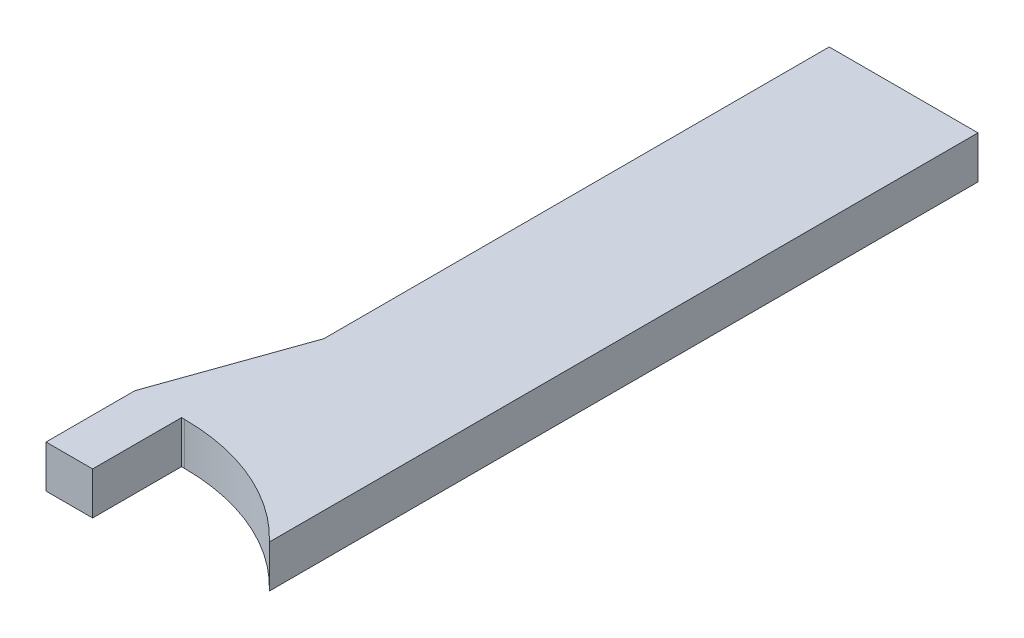
ISO-10303-21;
HEADER;
FILE_DESCRIPTION(('STEP AP214'),'2;1');
FILE_NAME('part.step','',(''),(''),'','','');
FILE_SCHEMA(('AUTOMOTIVE_DESIGN { 1 0 10303 214 1 1 1 1 }'));
ENDSEC;
DATA;
#1=APPLICATION_CONTEXT('core data for automotive mechanical design processes');
#2=APPLICATION_PROTOCOL_DEFINITION('international standard','automotive_design',2000,#1);
#3=PRODUCT_CONTEXT('',#1,'mechanical');
#4=PRODUCT('Part','Part','',(#3));
#5=PRODUCT_RELATED_PRODUCT_CATEGORY('part','',(#4));
#6=PRODUCT_DEFINITION_FORMATION('','',#4);
#7=PRODUCT_DEFINITION_CONTEXT('part definition',#1,'design');
#8=PRODUCT_DEFINITION('design','',#6,#7);
#9=PRODUCT_DEFINITION_SHAPE('','',#8);
#10=(LENGTH_UNIT() NAMED_UNIT(*) SI_UNIT(.MILLI.,.METRE.));
#11=(NAMED_UNIT(*) PLANE_ANGLE_UNIT() SI_UNIT($,.RADIAN.));
#12=(NAMED_UNIT(*) SI_UNIT($,.STERADIAN.) SOLID_ANGLE_UNIT());
#13=UNCERTAINTY_MEASURE_WITH_UNIT(LENGTH_MEASURE(1.E-05),#10,'distance_accuracy_value','');
#14=(GEOMETRIC_REPRESENTATION_CONTEXT(3) GLOBAL_UNCERTAINTY_ASSIGNED_CONTEXT((#13)) GLOBAL_UNIT_ASSIGNED_CONTEXT((#10,
#11,#12)) REPRESENTATION_CONTEXT('',''));
#15=CARTESIAN_POINT('',(0.,0.,0.));
#16=DIRECTION('',(0.,0.,1.));
#17=DIRECTION('',(1.,0.,0.));
#18=AXIS2_PLACEMENT_3D('',#15,#16,#17);
#19=CARTESIAN_POINT('',(0.,3.,0.));
#20=DIRECTION('',(0.,-1.,0.));
#21=DIRECTION('',(0.,0.,-1.));
#22=AXIS2_PLACEMENT_3D('',#19,#20,#21);
#23=CYLINDRICAL_SURFACE('',#22,14.5);
#24=CARTESIAN_POINT('',(0.,0.,0.));
#25=DIRECTION('',(0.,1.,0.));
#26=DIRECTION('',(0.,0.,1.));
#27=AXIS2_PLACEMENT_3D('',#24,#25,#26);
#28=CIRCLE('',#27,14.5);
#29=CARTESIAN_POINT('',(10.5,0.,-10.));
#30=VERTEX_POINT('',#29);
#31=CARTESIAN_POINT('',(0.,0.,-14.5));
#32=VERTEX_POINT('',#31);
#33=EDGE_CURVE('E171',#30,#32,#28,.T.);
#34=ORIENTED_EDGE('',*,*,#33,.F.);
#35=DIRECTION('',(0.,-1.,0.));
#36=VECTOR('',#35,1.);
#37=CARTESIAN_POINT('',(10.5,3.,-10.));
#38=LINE('',#37,#36);
#39=CARTESIAN_POINT('',(10.5,3.,-10.));
#40=VERTEX_POINT('',#39);
#41=EDGE_CURVE('E11',#40,#30,#38,.T.);
#42=ORIENTED_EDGE('',*,*,#41,.F.);
#43=CARTESIAN_POINT('',(0.,3.,0.));
#44=DIRECTION('',(0.,1.,0.));
#45=DIRECTION('',(0.,0.,1.));
#46=AXIS2_PLACEMENT_3D('',#43,#44,#45);
#47=CIRCLE('',#46,14.5);
#48=CARTESIAN_POINT('',(0.,3.,-14.5));
#49=VERTEX_POINT('',#48);
#50=EDGE_CURVE('E120',#40,#49,#47,.T.);
#51=ORIENTED_EDGE('',*,*,#50,.T.);
#52=DIRECTION('',(0.,-1.,0.));
#53=VECTOR('',#52,1.);
#54=CARTESIAN_POINT('',(0.,3.,-14.5));
#55=LINE('',#54,#53);
#56=EDGE_CURVE('E50',#49,#32,#55,.T.);
#57=ORIENTED_EDGE('',*,*,#56,.T.);
#58=EDGE_LOOP('',(#34,#42,#51,#57));
#59=FACE_BOUND('',#58,.T.);
#60=ADVANCED_FACE('F43',(#59),#23,.F.);
#61=CARTESIAN_POINT('',(10.5,3.,0.));
#62=DIRECTION('',(-1.,0.,0.));
#63=DIRECTION('',(0.,0.,1.));
#64=AXIS2_PLACEMENT_3D('',#61,#62,#63);
#65=PLANE('',#64);
#66=DIRECTION('',(0.,0.,-1.));
#67=VECTOR('',#66,1.);
#68=CARTESIAN_POINT('',(10.5,0.,0.));
#69=LINE('',#68,#67);
#70=CARTESIAN_POINT('',(10.5,0.,-60.));
#71=VERTEX_POINT('',#70);
#72=EDGE_CURVE('E128',#30,#71,#69,.T.);
#73=ORIENTED_EDGE('',*,*,#72,.T.);
#74=DIRECTION('',(0.,1.,0.));
#75=VECTOR('',#74,1.);
#76=CARTESIAN_POINT('',(10.5,-30.1271163298149,-60.));
#77=LINE('',#76,#75);
#78=CARTESIAN_POINT('',(10.5,3.,-60.));
#79=VERTEX_POINT('',#78);
#80=EDGE_CURVE('E125',#71,#79,#77,.T.);
#81=ORIENTED_EDGE('',*,*,#80,.T.);
#82=DIRECTION('',(0.,0.,-1.));
#83=VECTOR('',#82,1.);
#84=CARTESIAN_POINT('',(10.5,3.,0.));
#85=LINE('',#84,#83);
#86=EDGE_CURVE('E113',#40,#79,#85,.T.);
#87=ORIENTED_EDGE('',*,*,#86,.F.);
#88=ORIENTED_EDGE('',*,*,#41,.T.);
#89=EDGE_LOOP('',(#73,#81,#87,#88));
#90=FACE_BOUND('',#89,.T.);
#91=ADVANCED_FACE('F126',(#90),#65,.F.);
#92=CARTESIAN_POINT('',(0.,3.,0.));
#93=DIRECTION('',(1.,0.,0.));
#94=DIRECTION('',(0.,0.,-1.));
#95=AXIS2_PLACEMENT_3D('',#92,#93,#94);
#96=PLANE('',#95);
#97=DIRECTION('',(0.,0.,1.));
#98=VECTOR('',#97,1.);
#99=CARTESIAN_POINT('',(0.,0.,0.));
#100=LINE('',#99,#98);
#101=CARTESIAN_POINT('',(0.,0.,-60.));
#102=VERTEX_POINT('',#101);
#103=CARTESIAN_POINT('',(0.,0.,-24.3471749283453));
#104=VERTEX_POINT('',#103);
#105=EDGE_CURVE('E179',#102,#104,#100,.T.);
#106=ORIENTED_EDGE('',*,*,#105,.T.);
#107=DIRECTION('',(0.,1.,0.));
#108=VECTOR('',#107,1.);
#109=CARTESIAN_POINT('',(0.,0.,-24.3471749283453));
#110=LINE('',#109,#108);
#111=CARTESIAN_POINT('',(0.,3.,-24.3471749283453));
#112=VERTEX_POINT('',#111);
#113=EDGE_CURVE('E169',#104,#112,#110,.T.);
#114=ORIENTED_EDGE('',*,*,#113,.T.);
#115=DIRECTION('',(0.,0.,1.));
#116=VECTOR('',#115,1.);
#117=CARTESIAN_POINT('',(0.,3.,0.));
#118=LINE('',#117,#116);
#119=CARTESIAN_POINT('',(0.,3.,-60.));
#120=VERTEX_POINT('',#119);
#121=EDGE_CURVE('E122',#120,#112,#118,.T.);
#122=ORIENTED_EDGE('',*,*,#121,.F.);
#123=DIRECTION('',(0.,1.,0.));
#124=VECTOR('',#123,1.);
#125=CARTESIAN_POINT('',(0.,-30.1271163298149,-60.));
#126=LINE('',#125,#124);
#127=EDGE_CURVE('E132',#102,#120,#126,.T.);
#128=ORIENTED_EDGE('',*,*,#127,.F.);
#129=EDGE_LOOP('',(#106,#114,#122,#128));
#130=FACE_BOUND('',#129,.T.);
#131=ADVANCED_FACE('F193',(#130),#96,.F.);
#132=CARTESIAN_POINT('',(0.,3.,0.));
#133=DIRECTION('',(0.,1.,0.));
#134=DIRECTION('',(0.,0.,1.));
#135=AXIS2_PLACEMENT_3D('',#132,#133,#134);
#136=PLANE('',#135);
#137=ORIENTED_EDGE('',*,*,#50,.F.);
#138=ORIENTED_EDGE('',*,*,#86,.T.);
#139=DIRECTION('',(-1.,0.,0.));
#140=VECTOR('',#139,1.);
#141=CARTESIAN_POINT('',(0.,3.,-60.));
#142=LINE('',#141,#140);
#143=EDGE_CURVE('E118',#79,#120,#142,.T.);
#144=ORIENTED_EDGE('',*,*,#143,.T.);
#145=ORIENTED_EDGE('',*,*,#121,.T.);
#146=DIRECTION('',(0.3339697800326,0.,-0.942583781965814));
#147=VECTOR('',#146,1.);
#148=CARTESIAN_POINT('',(-7.66435671720969,3.,-2.71558197362528));
#149=LINE('',#148,#147);
#150=CARTESIAN_POINT('',(-3.48898305666085,3.,-14.5));
#151=VERTEX_POINT('',#150);
#152=EDGE_CURVE('E57',#151,#112,#149,.T.);
#153=ORIENTED_EDGE('',*,*,#152,.F.);
#154=DIRECTION('',(0.,0.,1.));
#155=VECTOR('',#154,1.);
#156=CARTESIAN_POINT('',(-3.48898305666085,3.,0.));
#157=LINE('',#156,#155);
#158=CARTESIAN_POINT('',(-3.48898305666085,3.,-8.22791840111646));
#159=VERTEX_POINT('',#158);
#160=EDGE_CURVE('E158',#151,#159,#157,.T.);
#161=ORIENTED_EDGE('',*,*,#160,.T.);
#162=DIRECTION('',(1.,0.,0.));
#163=VECTOR('',#162,1.);
#164=CARTESIAN_POINT('',(0.,3.,-8.22791840111646));
#165=LINE('',#164,#163);
#166=CARTESIAN_POINT('',(-0.2,3.,-8.22791840111646));
#167=VERTEX_POINT('',#166);
#168=EDGE_CURVE('E161',#159,#167,#165,.T.);
#169=ORIENTED_EDGE('',*,*,#168,.T.);
#170=DIRECTION('',(0.,0.,-1.));
#171=VECTOR('',#170,1.);
#172=CARTESIAN_POINT('',(-0.2,3.,0.));
#173=LINE('',#172,#171);
#174=CARTESIAN_POINT('',(-0.2,3.,-14.5));
#175=VERTEX_POINT('',#174);
#176=EDGE_CURVE('E164',#167,#175,#173,.T.);
#177=ORIENTED_EDGE('',*,*,#176,.T.);
#178=DIRECTION('',(-1.,0.,0.));
#179=VECTOR('',#178,1.);
#180=CARTESIAN_POINT('',(0.,3.,-14.5));
#181=LINE('',#180,#179);
#182=EDGE_CURVE('E145',#49,#175,#181,.T.);
#183=ORIENTED_EDGE('',*,*,#182,.F.);
#184=EDGE_LOOP('',(#137,#138,#144,#145,#153,#161,#169,#177,#183));
#185=FACE_BOUND('',#184,.T.);
#186=ADVANCED_FACE('F115',(#185),#136,.T.);
#187=CARTESIAN_POINT('',(0.,0.,0.));
#188=DIRECTION('',(0.,1.,0.));
#189=DIRECTION('',(0.,0.,1.));
#190=AXIS2_PLACEMENT_3D('',#187,#188,#189);
#191=PLANE('',#190);
#192=ORIENTED_EDGE('',*,*,#33,.T.);
#193=DIRECTION('',(-1.,0.,0.));
#194=VECTOR('',#193,1.);
#195=CARTESIAN_POINT('',(0.,0.,-14.5));
#196=LINE('',#195,#194);
#197=CARTESIAN_POINT('',(-0.2,0.,-14.5));
#198=VERTEX_POINT('',#197);
#199=EDGE_CURVE('E154',#32,#198,#196,.T.);
#200=ORIENTED_EDGE('',*,*,#199,.T.);
#201=DIRECTION('',(0.,0.,-1.));
#202=VECTOR('',#201,1.);
#203=CARTESIAN_POINT('',(-0.2,0.,0.));
#204=LINE('',#203,#202);
#205=CARTESIAN_POINT('',(-0.2,0.,-8.22791840111646));
#206=VERTEX_POINT('',#205);
#207=EDGE_CURVE('E151',#206,#198,#204,.T.);
#208=ORIENTED_EDGE('',*,*,#207,.F.);
#209=DIRECTION('',(1.,0.,0.));
#210=VECTOR('',#209,1.);
#211=CARTESIAN_POINT('',(0.,0.,-8.22791840111646));
#212=LINE('',#211,#210);
#213=CARTESIAN_POINT('',(-3.48898305666085,0.,-8.22791840111646));
#214=VERTEX_POINT('',#213);
#215=EDGE_CURVE('E148',#214,#206,#212,.T.);
#216=ORIENTED_EDGE('',*,*,#215,.F.);
#217=DIRECTION('',(0.,0.,1.));
#218=VECTOR('',#217,1.);
#219=CARTESIAN_POINT('',(-3.48898305666085,0.,0.));
#220=LINE('',#219,#218);
#221=CARTESIAN_POINT('',(-3.48898305666085,0.,-14.5));
#222=VERTEX_POINT('',#221);
#223=EDGE_CURVE('E144',#222,#214,#220,.T.);
#224=ORIENTED_EDGE('',*,*,#223,.F.);
#225=DIRECTION('',(0.3339697800326,0.,-0.942583781965814));
#226=VECTOR('',#225,1.);
#227=CARTESIAN_POINT('',(-7.66435671720969,0.,-2.71558197362528));
#228=LINE('',#227,#226);
#229=EDGE_CURVE('E142',#222,#104,#228,.T.);
#230=ORIENTED_EDGE('',*,*,#229,.T.);
#231=ORIENTED_EDGE('',*,*,#105,.F.);
#232=DIRECTION('',(1.,0.,0.));
#233=VECTOR('',#232,1.);
#234=CARTESIAN_POINT('',(0.,0.,-60.));
#235=LINE('',#234,#233);
#236=EDGE_CURVE('E140',#102,#71,#235,.T.);
#237=ORIENTED_EDGE('',*,*,#236,.T.);
#238=ORIENTED_EDGE('',*,*,#72,.F.);
#239=EDGE_LOOP('',(#192,#200,#208,#216,#224,#230,#231,#237,#238));
#240=FACE_BOUND('',#239,.T.);
#241=ADVANCED_FACE('F189',(#240),#191,.F.);
#242=CARTESIAN_POINT('',(-7.66435671720969,0.,-2.71558197362528));
#243=DIRECTION('',(0.942583781965814,0.,0.3339697800326));
#244=DIRECTION('',(0.3339697800326,0.,-0.942583781965814));
#245=AXIS2_PLACEMENT_3D('',#242,#243,#244);
#246=PLANE('',#245);
#247=ORIENTED_EDGE('',*,*,#152,.T.);
#248=ORIENTED_EDGE('',*,*,#113,.F.);
#249=ORIENTED_EDGE('',*,*,#229,.F.);
#250=DIRECTION('',(0.,1.,0.));
#251=VECTOR('',#250,1.);
#252=CARTESIAN_POINT('',(-3.48898305666085,0.,-14.5));
#253=LINE('',#252,#251);
#254=EDGE_CURVE('E156',#222,#151,#253,.T.);
#255=ORIENTED_EDGE('',*,*,#254,.T.);
#256=EDGE_LOOP('',(#247,#248,#249,#255));
#257=FACE_BOUND('',#256,.T.);
#258=ADVANCED_FACE('F208',(#257),#246,.F.);
#259=CARTESIAN_POINT('',(0.,0.,-14.5));
#260=DIRECTION('',(0.,0.,-1.));
#261=DIRECTION('',(-1.,0.,0.));
#262=AXIS2_PLACEMENT_3D('',#259,#260,#261);
#263=PLANE('',#262);
#264=ORIENTED_EDGE('',*,*,#182,.T.);
#265=DIRECTION('',(0.,1.,0.));
#266=VECTOR('',#265,1.);
#267=CARTESIAN_POINT('',(-0.2,0.,-14.5));
#268=LINE('',#267,#266);
#269=EDGE_CURVE('E172',#198,#175,#268,.T.);
#270=ORIENTED_EDGE('',*,*,#269,.F.);
#271=ORIENTED_EDGE('',*,*,#199,.F.);
#272=ORIENTED_EDGE('',*,*,#56,.F.);
#273=EDGE_LOOP('',(#264,#270,#271,#272));
#274=FACE_BOUND('',#273,.T.);
#275=ADVANCED_FACE('F206',(#274),#263,.F.);
#276=CARTESIAN_POINT('',(-0.2,0.,0.));
#277=DIRECTION('',(1.,0.,0.));
#278=DIRECTION('',(0.,0.,-1.));
#279=AXIS2_PLACEMENT_3D('',#276,#277,#278);
#280=PLANE('',#279);
#281=ORIENTED_EDGE('',*,*,#176,.F.);
#282=DIRECTION('',(0.,1.,0.));
#283=VECTOR('',#282,1.);
#284=CARTESIAN_POINT('',(-0.2,0.,-8.22791840111646));
#285=LINE('',#284,#283);
#286=EDGE_CURVE('E174',#206,#167,#285,.T.);
#287=ORIENTED_EDGE('',*,*,#286,.F.);
#288=ORIENTED_EDGE('',*,*,#207,.T.);
#289=ORIENTED_EDGE('',*,*,#269,.T.);
#290=EDGE_LOOP('',(#281,#287,#288,#289));
#291=FACE_BOUND('',#290,.T.);
#292=ADVANCED_FACE('F205',(#291),#280,.T.);
#293=CARTESIAN_POINT('',(0.,0.,-8.22791840111646));
#294=DIRECTION('',(0.,0.,1.));
#295=DIRECTION('',(1.,0.,0.));
#296=AXIS2_PLACEMENT_3D('',#293,#294,#295);
#297=PLANE('',#296);
#298=ORIENTED_EDGE('',*,*,#168,.F.);
#299=DIRECTION('',(0.,1.,0.));
#300=VECTOR('',#299,1.);
#301=CARTESIAN_POINT('',(-3.48898305666085,0.,-8.22791840111646));
#302=LINE('',#301,#300);
#303=EDGE_CURVE('E176',#214,#159,#302,.T.);
#304=ORIENTED_EDGE('',*,*,#303,.F.);
#305=ORIENTED_EDGE('',*,*,#215,.T.);
#306=ORIENTED_EDGE('',*,*,#286,.T.);
#307=EDGE_LOOP('',(#298,#304,#305,#306));
#308=FACE_BOUND('',#307,.T.);
#309=ADVANCED_FACE('F202',(#308),#297,.T.);
#310=CARTESIAN_POINT('',(-3.48898305666085,0.,0.));
#311=DIRECTION('',(-1.,0.,0.));
#312=DIRECTION('',(0.,0.,1.));
#313=AXIS2_PLACEMENT_3D('',#310,#311,#312);
#314=PLANE('',#313);
#315=ORIENTED_EDGE('',*,*,#160,.F.);
#316=ORIENTED_EDGE('',*,*,#254,.F.);
#317=ORIENTED_EDGE('',*,*,#223,.T.);
#318=ORIENTED_EDGE('',*,*,#303,.T.);
#319=EDGE_LOOP('',(#315,#316,#317,#318));
#320=FACE_BOUND('',#319,.T.);
#321=ADVANCED_FACE('F196',(#320),#314,.T.);
#322=CARTESIAN_POINT('',(0.,-30.1271163298149,-60.));
#323=DIRECTION('',(0.,0.,-1.));
#324=DIRECTION('',(-1.,0.,0.));
#325=AXIS2_PLACEMENT_3D('',#322,#323,#324);
#326=PLANE('',#325);
#327=ORIENTED_EDGE('',*,*,#236,.F.);
#328=ORIENTED_EDGE('',*,*,#127,.T.);
#329=ORIENTED_EDGE('',*,*,#143,.F.);
#330=ORIENTED_EDGE('',*,*,#80,.F.);
#331=EDGE_LOOP('',(#327,#328,#329,#330));
#332=FACE_BOUND('',#331,.T.);
#333=ADVANCED_FACE('F135',(#332),#326,.T.);
#334=CLOSED_SHELL('',(#60,#91,#131,#186,#241,#258,#275,#292,#309,#321,#333));
#335=MANIFOLD_SOLID_BREP('B2',#334);
#336=ADVANCED_BREP_SHAPE_REPRESENTATION('',(#18,#335),#14);
#337=SHAPE_DEFINITION_REPRESENTATION(#9,#336);
ENDSEC;
END-ISO-10303-21;
